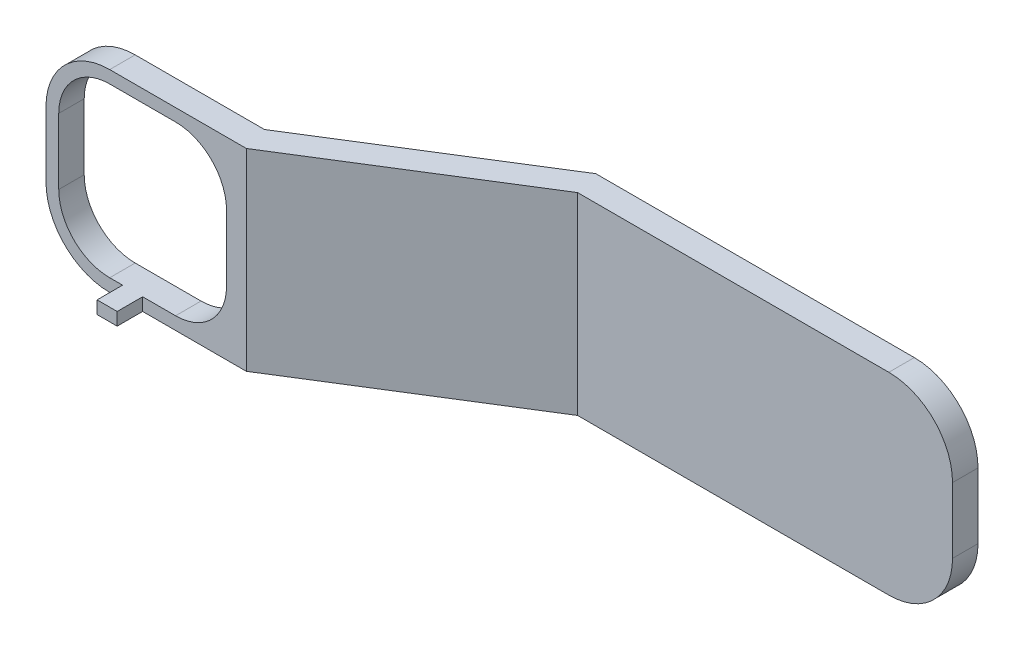
ISO-10303-21;
HEADER;
FILE_DESCRIPTION(('STEP AP214'),'2;1');
FILE_NAME('part.step','',(''),(''),'','','');
FILE_SCHEMA(('AUTOMOTIVE_DESIGN { 1 0 10303 214 1 1 1 1 }'));
ENDSEC;
DATA;
#1=APPLICATION_CONTEXT('core data for automotive mechanical design processes');
#2=APPLICATION_PROTOCOL_DEFINITION('international standard','automotive_design',2000,#1);
#3=PRODUCT_CONTEXT('',#1,'mechanical');
#4=PRODUCT('Part','Part','',(#3));
#5=PRODUCT_RELATED_PRODUCT_CATEGORY('part','',(#4));
#6=PRODUCT_DEFINITION_FORMATION('','',#4);
#7=PRODUCT_DEFINITION_CONTEXT('part definition',#1,'design');
#8=PRODUCT_DEFINITION('design','',#6,#7);
#9=PRODUCT_DEFINITION_SHAPE('','',#8);
#10=(LENGTH_UNIT() NAMED_UNIT(*) SI_UNIT(.MILLI.,.METRE.));
#11=(NAMED_UNIT(*) PLANE_ANGLE_UNIT() SI_UNIT($,.RADIAN.));
#12=(NAMED_UNIT(*) SI_UNIT($,.STERADIAN.) SOLID_ANGLE_UNIT());
#13=UNCERTAINTY_MEASURE_WITH_UNIT(LENGTH_MEASURE(1.E-05),#10,'distance_accuracy_value','');
#14=(GEOMETRIC_REPRESENTATION_CONTEXT(3) GLOBAL_UNCERTAINTY_ASSIGNED_CONTEXT((#13)) GLOBAL_UNIT_ASSIGNED_CONTEXT((#10,
#11,#12)) REPRESENTATION_CONTEXT('',''));
#15=CARTESIAN_POINT('',(0.,0.,0.));
#16=DIRECTION('',(0.,0.,1.));
#17=DIRECTION('',(1.,0.,0.));
#18=AXIS2_PLACEMENT_3D('',#15,#16,#17);
#19=CARTESIAN_POINT('',(-68.0247921049624,24.4663292826255,18.9002449029095));
#20=DIRECTION('',(0.,0.,-1.));
#21=DIRECTION('',(-1.,0.,0.));
#22=AXIS2_PLACEMENT_3D('',#19,#20,#21);
#23=PLANE('',#22);
#24=DIRECTION('',(0.,1.,0.));
#25=VECTOR('',#24,1.);
#26=CARTESIAN_POINT('',(-43.5577313617624,-21.1774762037745,18.9002449029095));
#27=LINE('',#26,#25);
#28=CARTESIAN_POINT('',(-43.5577313617624,-24.4032762037745,18.9002449029095));
#29=VERTEX_POINT('',#28);
#30=CARTESIAN_POINT('',(-43.5577313617624,-21.1774762037745,18.9002449029095));
#31=VERTEX_POINT('',#30);
#32=EDGE_CURVE('E54',#29,#31,#27,.T.);
#33=ORIENTED_EDGE('',*,*,#32,.F.);
#34=DIRECTION('',(1.,0.,0.));
#35=VECTOR('',#34,1.);
#36=CARTESIAN_POINT('',(-68.0247921049624,-24.4032762037745,18.9002449029095));
#37=LINE('',#36,#35);
#38=CARTESIAN_POINT('',(-17.3048920842471,-24.4032762037745,18.9002449029095));
#39=VERTEX_POINT('',#38);
#40=EDGE_CURVE('E348',#29,#39,#37,.T.);
#41=ORIENTED_EDGE('',*,*,#40,.T.);
#42=DIRECTION('',(0.,-1.,0.));
#43=VECTOR('',#42,1.);
#44=CARTESIAN_POINT('',(-17.3048920842471,24.4663292826255,18.9002449029095));
#45=LINE('',#44,#43);
#46=CARTESIAN_POINT('',(-17.3048920842471,24.4663292826255,18.9002449029095));
#47=VERTEX_POINT('',#46);
#48=EDGE_CURVE('E357',#47,#39,#45,.T.);
#49=ORIENTED_EDGE('',*,*,#48,.F.);
#50=DIRECTION('',(1.,0.,0.));
#51=VECTOR('',#50,1.);
#52=CARTESIAN_POINT('',(-68.0247921049624,24.4663292826255,18.9002449029095));
#53=LINE('',#52,#51);
#54=CARTESIAN_POINT('',(-51.8957921049624,24.4663292826255,18.9002449029095));
#55=VERTEX_POINT('',#54);
#56=EDGE_CURVE('E327',#55,#47,#53,.T.);
#57=ORIENTED_EDGE('',*,*,#56,.F.);
#58=CARTESIAN_POINT('',(-51.8957921049624,8.33732928262549,18.9002449029095));
#59=DIRECTION('',(0.,0.,-1.));
#60=DIRECTION('',(-1.,0.,0.));
#61=AXIS2_PLACEMENT_3D('',#58,#59,#60);
#62=CIRCLE('',#61,16.129);
#63=CARTESIAN_POINT('',(-68.0247921049624,8.33732928262549,18.9002449029095));
#64=VERTEX_POINT('',#63);
#65=EDGE_CURVE('E47',#55,#64,#62,.F.);
#66=ORIENTED_EDGE('',*,*,#65,.T.);
#67=DIRECTION('',(0.,-1.,0.));
#68=VECTOR('',#67,1.);
#69=CARTESIAN_POINT('',(-68.0247921049624,24.4663292826255,18.9002449029095));
#70=LINE('',#69,#68);
#71=CARTESIAN_POINT('',(-68.0247921049624,-8.2742762037745,18.9002449029095));
#72=VERTEX_POINT('',#71);
#73=EDGE_CURVE('E361',#64,#72,#70,.T.);
#74=ORIENTED_EDGE('',*,*,#73,.T.);
#75=CARTESIAN_POINT('',(-51.8957921049624,-8.2742762037745,18.9002449029095));
#76=DIRECTION('',(0.,0.,-1.));
#77=DIRECTION('',(-1.,0.,0.));
#78=AXIS2_PLACEMENT_3D('',#75,#76,#77);
#79=CIRCLE('',#78,16.129);
#80=CARTESIAN_POINT('',(-51.8957921049624,-24.4032762037745,18.9002449029095));
#81=VERTEX_POINT('',#80);
#82=EDGE_CURVE('E11',#72,#81,#79,.F.);
#83=ORIENTED_EDGE('',*,*,#82,.T.);
#84=CARTESIAN_POINT('',(-48.6377341049624,-24.4032762037745,18.9002449029095));
#85=VERTEX_POINT('',#84);
#86=EDGE_CURVE('E349',#81,#85,#37,.T.);
#87=ORIENTED_EDGE('',*,*,#86,.T.);
#88=DIRECTION('',(0.,-1.,0.));
#89=VECTOR('',#88,1.);
#90=CARTESIAN_POINT('',(-48.6377341049624,-21.1774762037745,18.9002449029095));
#91=LINE('',#90,#89);
#92=CARTESIAN_POINT('',(-48.6377341049624,-21.1774762037745,18.9002449029095));
#93=VERTEX_POINT('',#92);
#94=EDGE_CURVE('E219',#93,#85,#91,.T.);
#95=ORIENTED_EDGE('',*,*,#94,.F.);
#96=DIRECTION('',(1.,0.,0.));
#97=VECTOR('',#96,1.);
#98=CARTESIAN_POINT('',(-51.8957921049624,-21.1774762037745,18.9002449029095));
#99=LINE('',#98,#97);
#100=CARTESIAN_POINT('',(-51.8957921049624,-21.1774762037745,18.9002449029095));
#101=VERTEX_POINT('',#100);
#102=EDGE_CURVE('E256',#101,#93,#99,.T.);
#103=ORIENTED_EDGE('',*,*,#102,.F.);
#104=CARTESIAN_POINT('',(-51.8957921049624,-8.2742762037745,18.9002449029095));
#105=DIRECTION('',(0.,0.,1.));
#106=DIRECTION('',(1.,0.,0.));
#107=AXIS2_PLACEMENT_3D('',#104,#105,#106);
#108=CIRCLE('',#107,12.9032);
#109=CARTESIAN_POINT('',(-64.7989921049624,-8.2742762037745,18.9002449029095));
#110=VERTEX_POINT('',#109);
#111=EDGE_CURVE('E252',#110,#101,#108,.T.);
#112=ORIENTED_EDGE('',*,*,#111,.F.);
#113=DIRECTION('',(0.,-1.,0.));
#114=VECTOR('',#113,1.);
#115=CARTESIAN_POINT('',(-64.7989921049624,8.4018452826255,18.9002449029095));
#116=LINE('',#115,#114);
#117=CARTESIAN_POINT('',(-64.7989921049624,8.4018452826255,18.9002449029095));
#118=VERTEX_POINT('',#117);
#119=EDGE_CURVE('E248',#118,#110,#116,.T.);
#120=ORIENTED_EDGE('',*,*,#119,.F.);
#121=CARTESIAN_POINT('',(-51.8957921049624,8.40184528262551,18.9002449029095));
#122=DIRECTION('',(0.,0.,1.));
#123=DIRECTION('',(1.,0.,0.));
#124=AXIS2_PLACEMENT_3D('',#121,#122,#123);
#125=CIRCLE('',#124,12.9032);
#126=CARTESIAN_POINT('',(-51.8957921049624,21.3050452826255,18.9002449029095));
#127=VERTEX_POINT('',#126);
#128=EDGE_CURVE('E244',#127,#118,#125,.T.);
#129=ORIENTED_EDGE('',*,*,#128,.F.);
#130=DIRECTION('',(-1.,0.,0.));
#131=VECTOR('',#130,1.);
#132=CARTESIAN_POINT('',(-51.8957921049624,21.3050452826255,18.9002449029095));
#133=LINE('',#132,#131);
#134=CARTESIAN_POINT('',(-35.2196706185624,21.3050452826255,18.9002449029095));
#135=VERTEX_POINT('',#134);
#136=EDGE_CURVE('E240',#135,#127,#133,.T.);
#137=ORIENTED_EDGE('',*,*,#136,.F.);
#138=CARTESIAN_POINT('',(-35.2196706185624,8.40184528262552,18.9002449029095));
#139=DIRECTION('',(0.,0.,1.));
#140=DIRECTION('',(-1.,0.,0.));
#141=AXIS2_PLACEMENT_3D('',#138,#139,#140);
#142=CIRCLE('',#141,12.9032);
#143=CARTESIAN_POINT('',(-22.3164706185624,8.40184528262552,18.9002449029095));
#144=VERTEX_POINT('',#143);
#145=EDGE_CURVE('E236',#144,#135,#142,.T.);
#146=ORIENTED_EDGE('',*,*,#145,.F.);
#147=DIRECTION('',(0.,1.,0.));
#148=VECTOR('',#147,1.);
#149=CARTESIAN_POINT('',(-22.3164706185624,8.40184528262552,18.9002449029095));
#150=LINE('',#149,#148);
#151=CARTESIAN_POINT('',(-22.3164706185624,-8.2742762037745,18.9002449029095));
#152=VERTEX_POINT('',#151);
#153=EDGE_CURVE('E227',#152,#144,#150,.T.);
#154=ORIENTED_EDGE('',*,*,#153,.F.);
#155=CARTESIAN_POINT('',(-35.2196706185624,-8.2742762037745,18.9002449029095));
#156=DIRECTION('',(0.,0.,1.));
#157=DIRECTION('',(1.,0.,0.));
#158=AXIS2_PLACEMENT_3D('',#155,#156,#157);
#159=CIRCLE('',#158,12.9032);
#160=CARTESIAN_POINT('',(-35.2196706185624,-21.1774762037745,18.9002449029095));
#161=VERTEX_POINT('',#160);
#162=EDGE_CURVE('E223',#161,#152,#159,.T.);
#163=ORIENTED_EDGE('',*,*,#162,.F.);
#164=EDGE_CURVE('E59',#31,#161,#99,.T.);
#165=ORIENTED_EDGE('',*,*,#164,.F.);
#166=EDGE_LOOP('',(#33,#41,#49,#57,#66,#74,#83,#87,#95,#103,#112,#120,#129,#137,#146,#154,#163,#165));
#167=FACE_BOUND('',#166,.T.);
#168=ADVANCED_FACE('F38',(#167),#23,.F.);
#169=CARTESIAN_POINT('',(32.4576133814376,24.4663292826255,-13.3577550970905));
#170=DIRECTION('',(0.,0.,-1.));
#171=DIRECTION('',(-1.,0.,0.));
#172=AXIS2_PLACEMENT_3D('',#169,#170,#171);
#173=PLANE('',#172);
#174=DIRECTION('',(1.,0.,0.));
#175=VECTOR('',#174,1.);
#176=CARTESIAN_POINT('',(32.4576133814376,-24.4032762037745,-13.3577550970905));
#177=LINE('',#176,#175);
#178=CARTESIAN_POINT('',(34.3079079157529,-24.4032762037745,-13.3577550970905));
#179=VERTEX_POINT('',#178);
#180=CARTESIAN_POINT('',(113.102613381438,-24.4032762037745,-13.3577550970905));
#181=VERTEX_POINT('',#180);
#182=EDGE_CURVE('E310',#179,#181,#177,.T.);
#183=ORIENTED_EDGE('',*,*,#182,.T.);
#184=CARTESIAN_POINT('',(113.102613381438,-8.2742762037745,-13.3577550970905));
#185=DIRECTION('',(0.,0.,-1.));
#186=DIRECTION('',(-1.,0.,0.));
#187=AXIS2_PLACEMENT_3D('',#184,#185,#186);
#188=CIRCLE('',#187,16.129);
#189=CARTESIAN_POINT('',(129.231613381438,-8.2742762037745,-13.3577550970905));
#190=VERTEX_POINT('',#189);
#191=EDGE_CURVE('E395',#181,#190,#188,.F.);
#192=ORIENTED_EDGE('',*,*,#191,.T.);
#193=DIRECTION('',(0.,-1.,0.));
#194=VECTOR('',#193,1.);
#195=CARTESIAN_POINT('',(129.231613381438,24.4663292826255,-13.3577550970905));
#196=LINE('',#195,#194);
#197=CARTESIAN_POINT('',(129.231613381438,8.33732928262549,-13.3577550970905));
#198=VERTEX_POINT('',#197);
#199=EDGE_CURVE('E380',#198,#190,#196,.T.);
#200=ORIENTED_EDGE('',*,*,#199,.F.);
#201=CARTESIAN_POINT('',(113.102613381438,8.33732928262549,-13.3577550970905));
#202=DIRECTION('',(0.,0.,-1.));
#203=DIRECTION('',(-1.,0.,0.));
#204=AXIS2_PLACEMENT_3D('',#201,#202,#203);
#205=CIRCLE('',#204,16.129);
#206=CARTESIAN_POINT('',(113.102613381438,24.4663292826255,-13.3577550970905));
#207=VERTEX_POINT('',#206);
#208=EDGE_CURVE('E392',#198,#207,#205,.F.);
#209=ORIENTED_EDGE('',*,*,#208,.T.);
#210=DIRECTION('',(1.,0.,0.));
#211=VECTOR('',#210,1.);
#212=CARTESIAN_POINT('',(32.4576133814376,24.4663292826255,-13.3577550970905));
#213=LINE('',#212,#211);
#214=CARTESIAN_POINT('',(34.3079079157529,24.4663292826255,-13.3577550970905));
#215=VERTEX_POINT('',#214);
#216=EDGE_CURVE('E311',#215,#207,#213,.T.);
#217=ORIENTED_EDGE('',*,*,#216,.F.);
#218=DIRECTION('',(0.,-1.,0.));
#219=VECTOR('',#218,1.);
#220=CARTESIAN_POINT('',(34.3079079157529,24.4663292826255,-13.3577550970905));
#221=LINE('',#220,#219);
#222=EDGE_CURVE('E333',#215,#179,#221,.T.);
#223=ORIENTED_EDGE('',*,*,#222,.T.);
#224=EDGE_LOOP('',(#183,#192,#200,#209,#217,#223));
#225=FACE_BOUND('',#224,.T.);
#226=ADVANCED_FACE('F529',(#225),#173,.F.);
#227=CARTESIAN_POINT('',(129.231613381438,24.4663292826255,-19.8093550970905));
#228=DIRECTION('',(1.,0.,0.));
#229=DIRECTION('',(0.,0.,-1.));
#230=AXIS2_PLACEMENT_3D('',#227,#228,#229);
#231=PLANE('',#230);
#232=ORIENTED_EDGE('',*,*,#199,.T.);
#233=DIRECTION('',(0.,0.,1.));
#234=VECTOR('',#233,1.);
#235=CARTESIAN_POINT('',(129.231613381438,-8.2742762037745,-19.8093550970905));
#236=LINE('',#235,#234);
#237=CARTESIAN_POINT('',(129.231613381438,-8.2742762037745,-19.8093550970905));
#238=VERTEX_POINT('',#237);
#239=EDGE_CURVE('E402',#190,#238,#236,.F.);
#240=ORIENTED_EDGE('',*,*,#239,.T.);
#241=DIRECTION('',(0.,-1.,0.));
#242=VECTOR('',#241,1.);
#243=CARTESIAN_POINT('',(129.231613381438,24.4663292826255,-19.8093550970905));
#244=LINE('',#243,#242);
#245=CARTESIAN_POINT('',(129.231613381438,8.33732928262549,-19.8093550970905));
#246=VERTEX_POINT('',#245);
#247=EDGE_CURVE('E376',#246,#238,#244,.T.);
#248=ORIENTED_EDGE('',*,*,#247,.F.);
#249=DIRECTION('',(0.,0.,1.));
#250=VECTOR('',#249,1.);
#251=CARTESIAN_POINT('',(129.231613381438,8.33732928262549,-13.3577550970905));
#252=LINE('',#251,#250);
#253=EDGE_CURVE('E398',#246,#198,#252,.T.);
#254=ORIENTED_EDGE('',*,*,#253,.T.);
#255=EDGE_LOOP('',(#232,#240,#248,#254));
#256=FACE_BOUND('',#255,.T.);
#257=ADVANCED_FACE('F534',(#256),#231,.T.);
#258=CARTESIAN_POINT('',(32.4576133814376,24.4663292826255,-19.8093550970905));
#259=DIRECTION('',(0.,0.,-1.));
#260=DIRECTION('',(-1.,0.,0.));
#261=AXIS2_PLACEMENT_3D('',#258,#259,#260);
#262=PLANE('',#261);
#263=ORIENTED_EDGE('',*,*,#247,.T.);
#264=CARTESIAN_POINT('',(113.102613381438,-8.2742762037745,-19.8093550970905));
#265=DIRECTION('',(0.,0.,-1.));
#266=DIRECTION('',(-1.,0.,0.));
#267=AXIS2_PLACEMENT_3D('',#264,#265,#266);
#268=CIRCLE('',#267,16.129);
#269=CARTESIAN_POINT('',(113.102613381438,-24.4032762037745,-19.8093550970905));
#270=VERTEX_POINT('',#269);
#271=EDGE_CURVE('E408',#238,#270,#268,.T.);
#272=ORIENTED_EDGE('',*,*,#271,.T.);
#273=DIRECTION('',(1.,0.,0.));
#274=VECTOR('',#273,1.);
#275=CARTESIAN_POINT('',(32.4576133814376,-24.4032762037745,-19.8093550970905));
#276=LINE('',#275,#274);
#277=CARTESIAN_POINT('',(32.4576133814376,-24.4032762037745,-19.8093550970905));
#278=VERTEX_POINT('',#277);
#279=EDGE_CURVE('E337',#278,#270,#276,.T.);
#280=ORIENTED_EDGE('',*,*,#279,.F.);
#281=DIRECTION('',(0.,-1.,0.));
#282=VECTOR('',#281,1.);
#283=CARTESIAN_POINT('',(32.4576133814376,24.4663292826255,-19.8093550970905));
#284=LINE('',#283,#282);
#285=CARTESIAN_POINT('',(32.4576133814376,24.4663292826255,-19.8093550970905));
#286=VERTEX_POINT('',#285);
#287=EDGE_CURVE('E373',#286,#278,#284,.T.);
#288=ORIENTED_EDGE('',*,*,#287,.F.);
#289=DIRECTION('',(1.,0.,0.));
#290=VECTOR('',#289,1.);
#291=CARTESIAN_POINT('',(32.4576133814376,24.4663292826255,-19.8093550970905));
#292=LINE('',#291,#290);
#293=CARTESIAN_POINT('',(113.102613381438,24.4663292826255,-19.8093550970905));
#294=VERTEX_POINT('',#293);
#295=EDGE_CURVE('E315',#286,#294,#292,.T.);
#296=ORIENTED_EDGE('',*,*,#295,.T.);
#297=CARTESIAN_POINT('',(113.102613381438,8.33732928262549,-19.8093550970905));
#298=DIRECTION('',(0.,0.,-1.));
#299=DIRECTION('',(-1.,0.,0.));
#300=AXIS2_PLACEMENT_3D('',#297,#298,#299);
#301=CIRCLE('',#300,16.129);
#302=EDGE_CURVE('E405',#294,#246,#301,.T.);
#303=ORIENTED_EDGE('',*,*,#302,.T.);
#304=EDGE_LOOP('',(#263,#272,#280,#288,#296,#303));
#305=FACE_BOUND('',#304,.T.);
#306=ADVANCED_FACE('F547',(#305),#262,.T.);
#307=CARTESIAN_POINT('',(-19.1551866185624,24.4663292826255,12.4486449029095));
#308=DIRECTION('',(-0.52999894000318,0.,-0.847998304005088));
#309=DIRECTION('',(-0.847998304005088,0.,0.52999894000318));
#310=AXIS2_PLACEMENT_3D('',#307,#308,#309);
#311=PLANE('',#310);
#312=DIRECTION('',(0.847998304005088,0.,-0.52999894000318));
#313=VECTOR('',#312,1.);
#314=CARTESIAN_POINT('',(-19.1551866185624,-24.4032762037745,12.4486449029095));
#315=LINE('',#314,#313);
#316=CARTESIAN_POINT('',(-19.1551866185624,-24.4032762037745,12.4486449029095));
#317=VERTEX_POINT('',#316);
#318=EDGE_CURVE('E341',#317,#278,#315,.T.);
#319=ORIENTED_EDGE('',*,*,#318,.F.);
#320=DIRECTION('',(0.,-1.,0.));
#321=VECTOR('',#320,1.);
#322=CARTESIAN_POINT('',(-19.1551866185624,24.4663292826255,12.4486449029095));
#323=LINE('',#322,#321);
#324=CARTESIAN_POINT('',(-19.1551866185624,24.4663292826255,12.4486449029095));
#325=VERTEX_POINT('',#324);
#326=EDGE_CURVE('E369',#325,#317,#323,.T.);
#327=ORIENTED_EDGE('',*,*,#326,.F.);
#328=DIRECTION('',(0.847998304005088,0.,-0.52999894000318));
#329=VECTOR('',#328,1.);
#330=CARTESIAN_POINT('',(-19.1551866185624,24.4663292826255,12.4486449029095));
#331=LINE('',#330,#329);
#332=EDGE_CURVE('E320',#325,#286,#331,.T.);
#333=ORIENTED_EDGE('',*,*,#332,.T.);
#334=ORIENTED_EDGE('',*,*,#287,.T.);
#335=EDGE_LOOP('',(#319,#327,#333,#334));
#336=FACE_BOUND('',#335,.T.);
#337=ADVANCED_FACE('F453',(#336),#311,.T.);
#338=CARTESIAN_POINT('',(-68.0247921049624,24.4663292826255,12.4486449029095));
#339=DIRECTION('',(0.,0.,-1.));
#340=DIRECTION('',(-1.,0.,0.));
#341=AXIS2_PLACEMENT_3D('',#338,#339,#340);
#342=PLANE('',#341);
#343=CARTESIAN_POINT('',(-35.2196706185624,-8.2742762037745,12.4486449029095));
#344=DIRECTION('',(0.,0.,-1.));
#345=DIRECTION('',(-1.,0.,0.));
#346=AXIS2_PLACEMENT_3D('',#343,#344,#345);
#347=CIRCLE('',#346,12.9032);
#348=CARTESIAN_POINT('',(-22.3164706185624,-8.2742762037745,12.4486449029095));
#349=VERTEX_POINT('',#348);
#350=CARTESIAN_POINT('',(-35.2196706185624,-21.1774762037745,12.4486449029095));
#351=VERTEX_POINT('',#350);
#352=EDGE_CURVE('E307',#349,#351,#347,.T.);
#353=ORIENTED_EDGE('',*,*,#352,.F.);
#354=DIRECTION('',(0.,-1.,0.));
#355=VECTOR('',#354,1.);
#356=CARTESIAN_POINT('',(-22.3164706185624,24.4663292826255,12.4486449029095));
#357=LINE('',#356,#355);
#358=CARTESIAN_POINT('',(-22.3164706185624,8.40184528262552,12.4486449029095));
#359=VERTEX_POINT('',#358);
#360=EDGE_CURVE('E264',#359,#349,#357,.T.);
#361=ORIENTED_EDGE('',*,*,#360,.F.);
#362=CARTESIAN_POINT('',(-35.2196706185624,8.40184528262552,12.4486449029095));
#363=DIRECTION('',(0.,0.,-1.));
#364=DIRECTION('',(-1.,0.,0.));
#365=AXIS2_PLACEMENT_3D('',#362,#363,#364);
#366=CIRCLE('',#365,12.9032);
#367=CARTESIAN_POINT('',(-35.2196706185624,21.3050452826255,12.4486449029095));
#368=VERTEX_POINT('',#367);
#369=EDGE_CURVE('E288',#368,#359,#366,.T.);
#370=ORIENTED_EDGE('',*,*,#369,.F.);
#371=DIRECTION('',(1.,0.,0.));
#372=VECTOR('',#371,1.);
#373=CARTESIAN_POINT('',(-68.0247921049624,21.3050452826255,12.4486449029095));
#374=LINE('',#373,#372);
#375=CARTESIAN_POINT('',(-51.8957921049624,21.3050452826255,12.4486449029095));
#376=VERTEX_POINT('',#375);
#377=EDGE_CURVE('E292',#376,#368,#374,.T.);
#378=ORIENTED_EDGE('',*,*,#377,.F.);
#379=CARTESIAN_POINT('',(-51.8957921049624,8.40184528262551,12.4486449029095));
#380=DIRECTION('',(0.,0.,-1.));
#381=DIRECTION('',(-1.,0.,0.));
#382=AXIS2_PLACEMENT_3D('',#379,#380,#381);
#383=CIRCLE('',#382,12.9032);
#384=CARTESIAN_POINT('',(-64.7989921049624,8.4018452826255,12.4486449029095));
#385=VERTEX_POINT('',#384);
#386=EDGE_CURVE('E295',#385,#376,#383,.T.);
#387=ORIENTED_EDGE('',*,*,#386,.F.);
#388=DIRECTION('',(0.,1.,0.));
#389=VECTOR('',#388,1.);
#390=CARTESIAN_POINT('',(-64.7989921049624,24.4663292826255,12.4486449029095));
#391=LINE('',#390,#389);
#392=CARTESIAN_POINT('',(-64.7989921049624,-8.2742762037745,12.4486449029095));
#393=VERTEX_POINT('',#392);
#394=EDGE_CURVE('E298',#393,#385,#391,.T.);
#395=ORIENTED_EDGE('',*,*,#394,.F.);
#396=CARTESIAN_POINT('',(-51.8957921049624,-8.2742762037745,12.4486449029095));
#397=DIRECTION('',(0.,0.,-1.));
#398=DIRECTION('',(-1.,0.,0.));
#399=AXIS2_PLACEMENT_3D('',#396,#397,#398);
#400=CIRCLE('',#399,12.9032);
#401=CARTESIAN_POINT('',(-51.8957921049624,-21.1774762037745,12.4486449029095));
#402=VERTEX_POINT('',#401);
#403=EDGE_CURVE('E301',#402,#393,#400,.T.);
#404=ORIENTED_EDGE('',*,*,#403,.F.);
#405=DIRECTION('',(-1.,0.,0.));
#406=VECTOR('',#405,1.);
#407=CARTESIAN_POINT('',(-68.0247921049624,-21.1774762037745,12.4486449029095));
#408=LINE('',#407,#406);
#409=EDGE_CURVE('E304',#351,#402,#408,.T.);
#410=ORIENTED_EDGE('',*,*,#409,.F.);
#411=EDGE_LOOP('',(#353,#361,#370,#378,#387,#395,#404,#410));
#412=FACE_BOUND('',#411,.T.);
#413=DIRECTION('',(1.,0.,0.));
#414=VECTOR('',#413,1.);
#415=CARTESIAN_POINT('',(-68.0247921049624,-24.4032762037745,12.4486449029095));
#416=LINE('',#415,#414);
#417=CARTESIAN_POINT('',(-51.8957921049624,-24.4032762037745,12.4486449029095));
#418=VERTEX_POINT('',#417);
#419=EDGE_CURVE('E345',#418,#317,#416,.T.);
#420=ORIENTED_EDGE('',*,*,#419,.F.);
#421=CARTESIAN_POINT('',(-51.8957921049624,-8.2742762037745,12.4486449029095));
#422=DIRECTION('',(0.,0.,-1.));
#423=DIRECTION('',(-1.,0.,0.));
#424=AXIS2_PLACEMENT_3D('',#421,#422,#423);
#425=CIRCLE('',#424,16.129);
#426=CARTESIAN_POINT('',(-68.0247921049624,-8.2742762037745,12.4486449029095));
#427=VERTEX_POINT('',#426);
#428=EDGE_CURVE('E420',#418,#427,#425,.T.);
#429=ORIENTED_EDGE('',*,*,#428,.T.);
#430=DIRECTION('',(0.,-1.,0.));
#431=VECTOR('',#430,1.);
#432=CARTESIAN_POINT('',(-68.0247921049624,24.4663292826255,12.4486449029095));
#433=LINE('',#432,#431);
#434=CARTESIAN_POINT('',(-68.0247921049624,8.33732928262549,12.4486449029095));
#435=VERTEX_POINT('',#434);
#436=EDGE_CURVE('E365',#435,#427,#433,.T.);
#437=ORIENTED_EDGE('',*,*,#436,.F.);
#438=CARTESIAN_POINT('',(-51.8957921049624,8.33732928262549,12.4486449029095));
#439=DIRECTION('',(0.,0.,-1.));
#440=DIRECTION('',(-1.,0.,0.));
#441=AXIS2_PLACEMENT_3D('',#438,#439,#440);
#442=CIRCLE('',#441,16.129);
#443=CARTESIAN_POINT('',(-51.8957921049624,24.4663292826255,12.4486449029095));
#444=VERTEX_POINT('',#443);
#445=EDGE_CURVE('E417',#435,#444,#442,.T.);
#446=ORIENTED_EDGE('',*,*,#445,.T.);
#447=DIRECTION('',(1.,0.,0.));
#448=VECTOR('',#447,1.);
#449=CARTESIAN_POINT('',(-68.0247921049624,24.4663292826255,12.4486449029095));
#450=LINE('',#449,#448);
#451=EDGE_CURVE('E324',#444,#325,#450,.T.);
#452=ORIENTED_EDGE('',*,*,#451,.T.);
#453=ORIENTED_EDGE('',*,*,#326,.T.);
#454=EDGE_LOOP('',(#420,#429,#437,#446,#452,#453));
#455=FACE_BOUND('',#454,.T.);
#456=ADVANCED_FACE('F445',(#412,#455),#342,.T.);
#457=CARTESIAN_POINT('',(-68.0247921049624,24.4663292826255,18.9002449029095));
#458=DIRECTION('',(-1.,0.,0.));
#459=DIRECTION('',(0.,0.,1.));
#460=AXIS2_PLACEMENT_3D('',#457,#458,#459);
#461=PLANE('',#460);
#462=ORIENTED_EDGE('',*,*,#436,.T.);
#463=DIRECTION('',(0.,0.,-1.));
#464=VECTOR('',#463,1.);
#465=CARTESIAN_POINT('',(-68.0247921049624,-8.2742762037745,18.9002449029095));
#466=LINE('',#465,#464);
#467=EDGE_CURVE('E427',#427,#72,#466,.F.);
#468=ORIENTED_EDGE('',*,*,#467,.T.);
#469=ORIENTED_EDGE('',*,*,#73,.F.);
#470=DIRECTION('',(0.,0.,-1.));
#471=VECTOR('',#470,1.);
#472=CARTESIAN_POINT('',(-68.0247921049624,8.33732928262549,12.4486449029095));
#473=LINE('',#472,#471);
#474=EDGE_CURVE('E423',#64,#435,#473,.T.);
#475=ORIENTED_EDGE('',*,*,#474,.T.);
#476=EDGE_LOOP('',(#462,#468,#469,#475));
#477=FACE_BOUND('',#476,.T.);
#478=ADVANCED_FACE('F439',(#477),#461,.T.);
#479=CARTESIAN_POINT('',(-15.7358454572378,24.4663292826255,17.9195907610287));
#480=DIRECTION('',(-0.52999894000318,0.,-0.847998304005088));
#481=DIRECTION('',(-0.847998304005088,0.,0.52999894000318));
#482=AXIS2_PLACEMENT_3D('',#479,#480,#481);
#483=PLANE('',#482);
#484=DIRECTION('',(0.847998304005088,0.,-0.52999894000318));
#485=VECTOR('',#484,1.);
#486=CARTESIAN_POINT('',(-15.7358454572378,-24.4032762037745,17.9195907610287));
#487=LINE('',#486,#485);
#488=EDGE_CURVE('E316',#39,#179,#487,.T.);
#489=ORIENTED_EDGE('',*,*,#488,.T.);
#490=ORIENTED_EDGE('',*,*,#222,.F.);
#491=DIRECTION('',(0.847998304005088,0.,-0.52999894000318));
#492=VECTOR('',#491,1.);
#493=CARTESIAN_POINT('',(-15.7358454572378,24.4663292826255,17.9195907610287));
#494=LINE('',#493,#492);
#495=EDGE_CURVE('E330',#47,#215,#494,.T.);
#496=ORIENTED_EDGE('',*,*,#495,.F.);
#497=ORIENTED_EDGE('',*,*,#48,.T.);
#498=EDGE_LOOP('',(#489,#490,#496,#497));
#499=FACE_BOUND('',#498,.T.);
#500=ADVANCED_FACE('F539',(#499),#483,.F.);
#501=CARTESIAN_POINT('',(-68.0247921049624,24.4663292826255,12.4486449029095));
#502=DIRECTION('',(0.,-1.,0.));
#503=DIRECTION('',(-1.,0.,0.));
#504=AXIS2_PLACEMENT_3D('',#501,#502,#503);
#505=PLANE('',#504);
#506=ORIENTED_EDGE('',*,*,#216,.T.);
#507=DIRECTION('',(0.,0.,1.));
#508=VECTOR('',#507,1.);
#509=CARTESIAN_POINT('',(113.102613381438,24.4663292826255,-19.8093550970905));
#510=LINE('',#509,#508);
#511=EDGE_CURVE('E414',#207,#294,#510,.F.);
#512=ORIENTED_EDGE('',*,*,#511,.T.);
#513=ORIENTED_EDGE('',*,*,#295,.F.);
#514=ORIENTED_EDGE('',*,*,#332,.F.);
#515=ORIENTED_EDGE('',*,*,#451,.F.);
#516=DIRECTION('',(0.,0.,-1.));
#517=VECTOR('',#516,1.);
#518=CARTESIAN_POINT('',(-51.8957921049624,24.4663292826255,18.9002449029095));
#519=LINE('',#518,#517);
#520=EDGE_CURVE('E411',#444,#55,#519,.F.);
#521=ORIENTED_EDGE('',*,*,#520,.T.);
#522=ORIENTED_EDGE('',*,*,#56,.T.);
#523=ORIENTED_EDGE('',*,*,#495,.T.);
#524=EDGE_LOOP('',(#506,#512,#513,#514,#515,#521,#522,#523));
#525=FACE_BOUND('',#524,.T.);
#526=ADVANCED_FACE('F449',(#525),#505,.F.);
#527=CARTESIAN_POINT('',(-68.0247921049624,-24.4032762037745,12.4486449029095));
#528=DIRECTION('',(0.,-1.,0.));
#529=DIRECTION('',(-1.,0.,0.));
#530=AXIS2_PLACEMENT_3D('',#527,#528,#529);
#531=PLANE('',#530);
#532=ORIENTED_EDGE('',*,*,#279,.T.);
#533=DIRECTION('',(0.,0.,1.));
#534=VECTOR('',#533,1.);
#535=CARTESIAN_POINT('',(113.102613381438,-24.4032762037745,12.4486449029095));
#536=LINE('',#535,#534);
#537=EDGE_CURVE('E388',#270,#181,#536,.T.);
#538=ORIENTED_EDGE('',*,*,#537,.T.);
#539=ORIENTED_EDGE('',*,*,#182,.F.);
#540=ORIENTED_EDGE('',*,*,#488,.F.);
#541=ORIENTED_EDGE('',*,*,#40,.F.);
#542=DIRECTION('',(0.,0.,-1.));
#543=VECTOR('',#542,1.);
#544=CARTESIAN_POINT('',(-43.5577313617624,-24.4032762037745,25.3518449029095));
#545=LINE('',#544,#543);
#546=CARTESIAN_POINT('',(-43.5577313617624,-24.4032762037745,25.3518449029095));
#547=VERTEX_POINT('',#546);
#548=EDGE_CURVE('E470',#547,#29,#545,.T.);
#549=ORIENTED_EDGE('',*,*,#548,.F.);
#550=DIRECTION('',(1.,0.,0.));
#551=VECTOR('',#550,1.);
#552=CARTESIAN_POINT('',(-43.5577313617624,-24.4032762037745,25.3518449029095));
#553=LINE('',#552,#551);
#554=CARTESIAN_POINT('',(-48.6377341049624,-24.4032762037745,25.3518449029095));
#555=VERTEX_POINT('',#554);
#556=EDGE_CURVE('E214',#555,#547,#553,.T.);
#557=ORIENTED_EDGE('',*,*,#556,.F.);
#558=DIRECTION('',(0.,0.,-1.));
#559=VECTOR('',#558,1.);
#560=CARTESIAN_POINT('',(-48.6377341049624,-24.4032762037745,25.3518449029095));
#561=LINE('',#560,#559);
#562=EDGE_CURVE('E229',#555,#85,#561,.T.);
#563=ORIENTED_EDGE('',*,*,#562,.T.);
#564=ORIENTED_EDGE('',*,*,#86,.F.);
#565=DIRECTION('',(0.,0.,-1.));
#566=VECTOR('',#565,1.);
#567=CARTESIAN_POINT('',(-51.8957921049624,-24.4032762037745,12.4486449029095));
#568=LINE('',#567,#566);
#569=EDGE_CURVE('E384',#81,#418,#568,.T.);
#570=ORIENTED_EDGE('',*,*,#569,.T.);
#571=ORIENTED_EDGE('',*,*,#419,.T.);
#572=ORIENTED_EDGE('',*,*,#318,.T.);
#573=EDGE_LOOP('',(#532,#538,#539,#540,#541,#549,#557,#563,#564,#570,#571,#572));
#574=FACE_BOUND('',#573,.T.);
#575=ADVANCED_FACE('F456',(#574),#531,.T.);
#576=CARTESIAN_POINT('',(-35.2196706185624,-8.2742762037745,-19.8093550970905));
#577=DIRECTION('',(0.,0.,1.));
#578=DIRECTION('',(1.,0.,0.));
#579=AXIS2_PLACEMENT_3D('',#576,#577,#578);
#580=CYLINDRICAL_SURFACE('',#579,12.9032);
#581=ORIENTED_EDGE('',*,*,#352,.T.);
#582=DIRECTION('',(0.,0.,1.));
#583=VECTOR('',#582,1.);
#584=CARTESIAN_POINT('',(-35.2196706185624,-21.1774762037745,-19.8093550970905));
#585=LINE('',#584,#583);
#586=EDGE_CURVE('E260',#351,#161,#585,.T.);
#587=ORIENTED_EDGE('',*,*,#586,.T.);
#588=ORIENTED_EDGE('',*,*,#162,.T.);
#589=DIRECTION('',(0.,0.,1.));
#590=VECTOR('',#589,1.);
#591=CARTESIAN_POINT('',(-22.3164706185624,-8.2742762037745,-19.8093550970905));
#592=LINE('',#591,#590);
#593=EDGE_CURVE('E259',#349,#152,#592,.T.);
#594=ORIENTED_EDGE('',*,*,#593,.F.);
#595=EDGE_LOOP('',(#581,#587,#588,#594));
#596=FACE_BOUND('',#595,.T.);
#597=ADVANCED_FACE('F486',(#596),#580,.F.);
#598=CARTESIAN_POINT('',(-51.8957921049624,-21.1774762037745,-19.8093550970905));
#599=DIRECTION('',(0.,-1.,0.));
#600=DIRECTION('',(0.,0.,-1.));
#601=AXIS2_PLACEMENT_3D('',#598,#599,#600);
#602=PLANE('',#601);
#603=ORIENTED_EDGE('',*,*,#409,.T.);
#604=DIRECTION('',(0.,0.,1.));
#605=VECTOR('',#604,1.);
#606=CARTESIAN_POINT('',(-51.8957921049624,-21.1774762037745,-19.8093550970905));
#607=LINE('',#606,#605);
#608=EDGE_CURVE('E265',#402,#101,#607,.T.);
#609=ORIENTED_EDGE('',*,*,#608,.T.);
#610=ORIENTED_EDGE('',*,*,#102,.T.);
#611=DIRECTION('',(0.,0.,-1.));
#612=VECTOR('',#611,1.);
#613=CARTESIAN_POINT('',(-48.6377341049624,-21.1774762037745,25.3518449029095));
#614=LINE('',#613,#612);
#615=CARTESIAN_POINT('',(-48.6377341049624,-21.1774762037745,25.3518449029095));
#616=VERTEX_POINT('',#615);
#617=EDGE_CURVE('E204',#616,#93,#614,.T.);
#618=ORIENTED_EDGE('',*,*,#617,.F.);
#619=DIRECTION('',(-1.,0.,0.));
#620=VECTOR('',#619,1.);
#621=CARTESIAN_POINT('',(-43.5577313617624,-21.1774762037745,25.3518449029095));
#622=LINE('',#621,#620);
#623=CARTESIAN_POINT('',(-43.5577313617624,-21.1774762037745,25.3518449029095));
#624=VERTEX_POINT('',#623);
#625=EDGE_CURVE('E197',#624,#616,#622,.T.);
#626=ORIENTED_EDGE('',*,*,#625,.F.);
#627=DIRECTION('',(0.,0.,-1.));
#628=VECTOR('',#627,1.);
#629=CARTESIAN_POINT('',(-43.5577313617624,-21.1774762037745,25.3518449029095));
#630=LINE('',#629,#628);
#631=EDGE_CURVE('E201',#624,#31,#630,.T.);
#632=ORIENTED_EDGE('',*,*,#631,.T.);
#633=ORIENTED_EDGE('',*,*,#164,.T.);
#634=ORIENTED_EDGE('',*,*,#586,.F.);
#635=EDGE_LOOP('',(#603,#609,#610,#618,#626,#632,#633,#634));
#636=FACE_BOUND('',#635,.T.);
#637=ADVANCED_FACE('F199',(#636),#602,.F.);
#638=CARTESIAN_POINT('',(-51.8957921049624,-8.2742762037745,-19.8093550970905));
#639=DIRECTION('',(0.,0.,1.));
#640=DIRECTION('',(1.,0.,0.));
#641=AXIS2_PLACEMENT_3D('',#638,#639,#640);
#642=CYLINDRICAL_SURFACE('',#641,12.9032);
#643=ORIENTED_EDGE('',*,*,#403,.T.);
#644=DIRECTION('',(0.,0.,1.));
#645=VECTOR('',#644,1.);
#646=CARTESIAN_POINT('',(-64.7989921049624,-8.2742762037745,-19.8093550970905));
#647=LINE('',#646,#645);
#648=EDGE_CURVE('E268',#393,#110,#647,.T.);
#649=ORIENTED_EDGE('',*,*,#648,.T.);
#650=ORIENTED_EDGE('',*,*,#111,.T.);
#651=ORIENTED_EDGE('',*,*,#608,.F.);
#652=EDGE_LOOP('',(#643,#649,#650,#651));
#653=FACE_BOUND('',#652,.T.);
#654=ADVANCED_FACE('F501',(#653),#642,.F.);
#655=CARTESIAN_POINT('',(-64.7989921049624,8.4018452826255,-19.8093550970905));
#656=DIRECTION('',(-1.,0.,0.));
#657=DIRECTION('',(0.,-1.,0.));
#658=AXIS2_PLACEMENT_3D('',#655,#656,#657);
#659=PLANE('',#658);
#660=ORIENTED_EDGE('',*,*,#394,.T.);
#661=DIRECTION('',(0.,0.,1.));
#662=VECTOR('',#661,1.);
#663=CARTESIAN_POINT('',(-64.7989921049624,8.4018452826255,-19.8093550970905));
#664=LINE('',#663,#662);
#665=EDGE_CURVE('E271',#385,#118,#664,.T.);
#666=ORIENTED_EDGE('',*,*,#665,.T.);
#667=ORIENTED_EDGE('',*,*,#119,.T.);
#668=ORIENTED_EDGE('',*,*,#648,.F.);
#669=EDGE_LOOP('',(#660,#666,#667,#668));
#670=FACE_BOUND('',#669,.T.);
#671=ADVANCED_FACE('F507',(#670),#659,.F.);
#672=CARTESIAN_POINT('',(-51.8957921049624,8.40184528262551,-19.8093550970905));
#673=DIRECTION('',(0.,0.,1.));
#674=DIRECTION('',(1.,0.,0.));
#675=AXIS2_PLACEMENT_3D('',#672,#673,#674);
#676=CYLINDRICAL_SURFACE('',#675,12.9032);
#677=ORIENTED_EDGE('',*,*,#386,.T.);
#678=DIRECTION('',(0.,0.,1.));
#679=VECTOR('',#678,1.);
#680=CARTESIAN_POINT('',(-51.8957921049624,21.3050452826255,-19.8093550970905));
#681=LINE('',#680,#679);
#682=EDGE_CURVE('E274',#376,#127,#681,.T.);
#683=ORIENTED_EDGE('',*,*,#682,.T.);
#684=ORIENTED_EDGE('',*,*,#128,.T.);
#685=ORIENTED_EDGE('',*,*,#665,.F.);
#686=EDGE_LOOP('',(#677,#683,#684,#685));
#687=FACE_BOUND('',#686,.T.);
#688=ADVANCED_FACE('F511',(#687),#676,.F.);
#689=CARTESIAN_POINT('',(-51.8957921049624,21.3050452826255,-19.8093550970905));
#690=DIRECTION('',(0.,1.,0.));
#691=DIRECTION('',(-1.,0.,0.));
#692=AXIS2_PLACEMENT_3D('',#689,#690,#691);
#693=PLANE('',#692);
#694=ORIENTED_EDGE('',*,*,#377,.T.);
#695=DIRECTION('',(0.,0.,1.));
#696=VECTOR('',#695,1.);
#697=CARTESIAN_POINT('',(-35.2196706185624,21.3050452826255,-19.8093550970905));
#698=LINE('',#697,#696);
#699=EDGE_CURVE('E277',#368,#135,#698,.T.);
#700=ORIENTED_EDGE('',*,*,#699,.T.);
#701=ORIENTED_EDGE('',*,*,#136,.T.);
#702=ORIENTED_EDGE('',*,*,#682,.F.);
#703=EDGE_LOOP('',(#694,#700,#701,#702));
#704=FACE_BOUND('',#703,.T.);
#705=ADVANCED_FACE('F515',(#704),#693,.F.);
#706=CARTESIAN_POINT('',(-35.2196706185624,8.40184528262552,-19.8093550970905));
#707=DIRECTION('',(0.,0.,1.));
#708=DIRECTION('',(1.,0.,0.));
#709=AXIS2_PLACEMENT_3D('',#706,#707,#708);
#710=CYLINDRICAL_SURFACE('',#709,12.9032);
#711=ORIENTED_EDGE('',*,*,#369,.T.);
#712=DIRECTION('',(0.,0.,1.));
#713=VECTOR('',#712,1.);
#714=CARTESIAN_POINT('',(-22.3164706185624,8.40184528262552,-19.8093550970905));
#715=LINE('',#714,#713);
#716=EDGE_CURVE('E280',#359,#144,#715,.T.);
#717=ORIENTED_EDGE('',*,*,#716,.T.);
#718=ORIENTED_EDGE('',*,*,#145,.T.);
#719=ORIENTED_EDGE('',*,*,#699,.F.);
#720=EDGE_LOOP('',(#711,#717,#718,#719));
#721=FACE_BOUND('',#720,.T.);
#722=ADVANCED_FACE('F518',(#721),#710,.F.);
#723=CARTESIAN_POINT('',(-22.3164706185624,8.40184528262552,-19.8093550970905));
#724=DIRECTION('',(1.,0.,0.));
#725=DIRECTION('',(0.,1.,0.));
#726=AXIS2_PLACEMENT_3D('',#723,#724,#725);
#727=PLANE('',#726);
#728=ORIENTED_EDGE('',*,*,#360,.T.);
#729=ORIENTED_EDGE('',*,*,#593,.T.);
#730=ORIENTED_EDGE('',*,*,#153,.T.);
#731=ORIENTED_EDGE('',*,*,#716,.F.);
#732=EDGE_LOOP('',(#728,#729,#730,#731));
#733=FACE_BOUND('',#732,.T.);
#734=ADVANCED_FACE('F493',(#733),#727,.F.);
#735=CARTESIAN_POINT('',(113.102613381438,-8.2742762037745,12.4486449029095));
#736=DIRECTION('',(0.,0.,1.));
#737=DIRECTION('',(1.,0.,0.));
#738=AXIS2_PLACEMENT_3D('',#735,#736,#737);
#739=CYLINDRICAL_SURFACE('',#738,16.129);
#740=ORIENTED_EDGE('',*,*,#271,.F.);
#741=ORIENTED_EDGE('',*,*,#239,.F.);
#742=ORIENTED_EDGE('',*,*,#191,.F.);
#743=ORIENTED_EDGE('',*,*,#537,.F.);
#744=EDGE_LOOP('',(#740,#741,#742,#743));
#745=FACE_BOUND('',#744,.T.);
#746=ADVANCED_FACE('F525',(#745),#739,.T.);
#747=CARTESIAN_POINT('',(113.102613381438,8.33732928262549,-19.8093550970905));
#748=DIRECTION('',(0.,0.,-1.));
#749=DIRECTION('',(-1.,0.,0.));
#750=AXIS2_PLACEMENT_3D('',#747,#748,#749);
#751=CYLINDRICAL_SURFACE('',#750,16.129);
#752=ORIENTED_EDGE('',*,*,#302,.F.);
#753=ORIENTED_EDGE('',*,*,#511,.F.);
#754=ORIENTED_EDGE('',*,*,#208,.F.);
#755=ORIENTED_EDGE('',*,*,#253,.F.);
#756=EDGE_LOOP('',(#752,#753,#754,#755));
#757=FACE_BOUND('',#756,.T.);
#758=ADVANCED_FACE('F556',(#757),#751,.T.);
#759=CARTESIAN_POINT('',(-51.8957921049624,-8.2742762037745,12.4486449029095));
#760=DIRECTION('',(0.,0.,-1.));
#761=DIRECTION('',(-1.,0.,0.));
#762=AXIS2_PLACEMENT_3D('',#759,#760,#761);
#763=CYLINDRICAL_SURFACE('',#762,16.129);
#764=ORIENTED_EDGE('',*,*,#82,.F.);
#765=ORIENTED_EDGE('',*,*,#467,.F.);
#766=ORIENTED_EDGE('',*,*,#428,.F.);
#767=ORIENTED_EDGE('',*,*,#569,.F.);
#768=EDGE_LOOP('',(#764,#765,#766,#767));
#769=FACE_BOUND('',#768,.T.);
#770=ADVANCED_FACE('F461',(#769),#763,.T.);
#771=CARTESIAN_POINT('',(-51.8957921049624,8.33732928262549,18.9002449029095));
#772=DIRECTION('',(0.,0.,1.));
#773=DIRECTION('',(1.,0.,0.));
#774=AXIS2_PLACEMENT_3D('',#771,#772,#773);
#775=CYLINDRICAL_SURFACE('',#774,16.129);
#776=ORIENTED_EDGE('',*,*,#65,.F.);
#777=ORIENTED_EDGE('',*,*,#520,.F.);
#778=ORIENTED_EDGE('',*,*,#445,.F.);
#779=ORIENTED_EDGE('',*,*,#474,.F.);
#780=EDGE_LOOP('',(#776,#777,#778,#779));
#781=FACE_BOUND('',#780,.T.);
#782=ADVANCED_FACE('F40',(#781),#775,.T.);
#783=CARTESIAN_POINT('',(-43.5577313617624,-21.1774762037745,25.3518449029095));
#784=DIRECTION('',(-1.,0.,0.));
#785=DIRECTION('',(0.,0.,1.));
#786=AXIS2_PLACEMENT_3D('',#783,#784,#785);
#787=PLANE('',#786);
#788=ORIENTED_EDGE('',*,*,#32,.T.);
#789=ORIENTED_EDGE('',*,*,#631,.F.);
#790=DIRECTION('',(0.,1.,0.));
#791=VECTOR('',#790,1.);
#792=CARTESIAN_POINT('',(-43.5577313617624,-21.1774762037745,25.3518449029095));
#793=LINE('',#792,#791);
#794=EDGE_CURVE('E209',#547,#624,#793,.T.);
#795=ORIENTED_EDGE('',*,*,#794,.F.);
#796=ORIENTED_EDGE('',*,*,#548,.T.);
#797=EDGE_LOOP('',(#788,#789,#795,#796));
#798=FACE_BOUND('',#797,.T.);
#799=ADVANCED_FACE('F221',(#798),#787,.F.);
#800=CARTESIAN_POINT('',(-48.6377341049624,-21.1774762037745,25.3518449029095));
#801=DIRECTION('',(1.,0.,0.));
#802=DIRECTION('',(0.,1.,0.));
#803=AXIS2_PLACEMENT_3D('',#800,#801,#802);
#804=PLANE('',#803);
#805=ORIENTED_EDGE('',*,*,#94,.T.);
#806=ORIENTED_EDGE('',*,*,#562,.F.);
#807=DIRECTION('',(0.,-1.,0.));
#808=VECTOR('',#807,1.);
#809=CARTESIAN_POINT('',(-48.6377341049624,-21.1774762037745,25.3518449029095));
#810=LINE('',#809,#808);
#811=EDGE_CURVE('E208',#616,#555,#810,.T.);
#812=ORIENTED_EDGE('',*,*,#811,.F.);
#813=ORIENTED_EDGE('',*,*,#617,.T.);
#814=EDGE_LOOP('',(#805,#806,#812,#813));
#815=FACE_BOUND('',#814,.T.);
#816=ADVANCED_FACE('F466',(#815),#804,.F.);
#817=CARTESIAN_POINT('',(-68.0247921049624,0.0315265394254964,25.3518449029095));
#818=DIRECTION('',(0.,0.,-1.));
#819=DIRECTION('',(-1.,0.,0.));
#820=AXIS2_PLACEMENT_3D('',#817,#818,#819);
#821=PLANE('',#820);
#822=ORIENTED_EDGE('',*,*,#794,.T.);
#823=ORIENTED_EDGE('',*,*,#625,.T.);
#824=ORIENTED_EDGE('',*,*,#811,.T.);
#825=ORIENTED_EDGE('',*,*,#556,.T.);
#826=EDGE_LOOP('',(#822,#823,#824,#825));
#827=FACE_BOUND('',#826,.T.);
#828=ADVANCED_FACE('F212',(#827),#821,.F.);
#829=CLOSED_SHELL('',(#168,#226,#257,#306,#337,#456,#478,#500,#526,#575,#597,#637,#654,#671,
#688,#705,#722,#734,#746,#758,#770,#782,#799,#816,#828));
#830=MANIFOLD_SOLID_BREP('B2',#829);
#831=ADVANCED_BREP_SHAPE_REPRESENTATION('',(#18,#830),#14);
#832=SHAPE_DEFINITION_REPRESENTATION(#9,#831);
ENDSEC;
END-ISO-10303-21;
